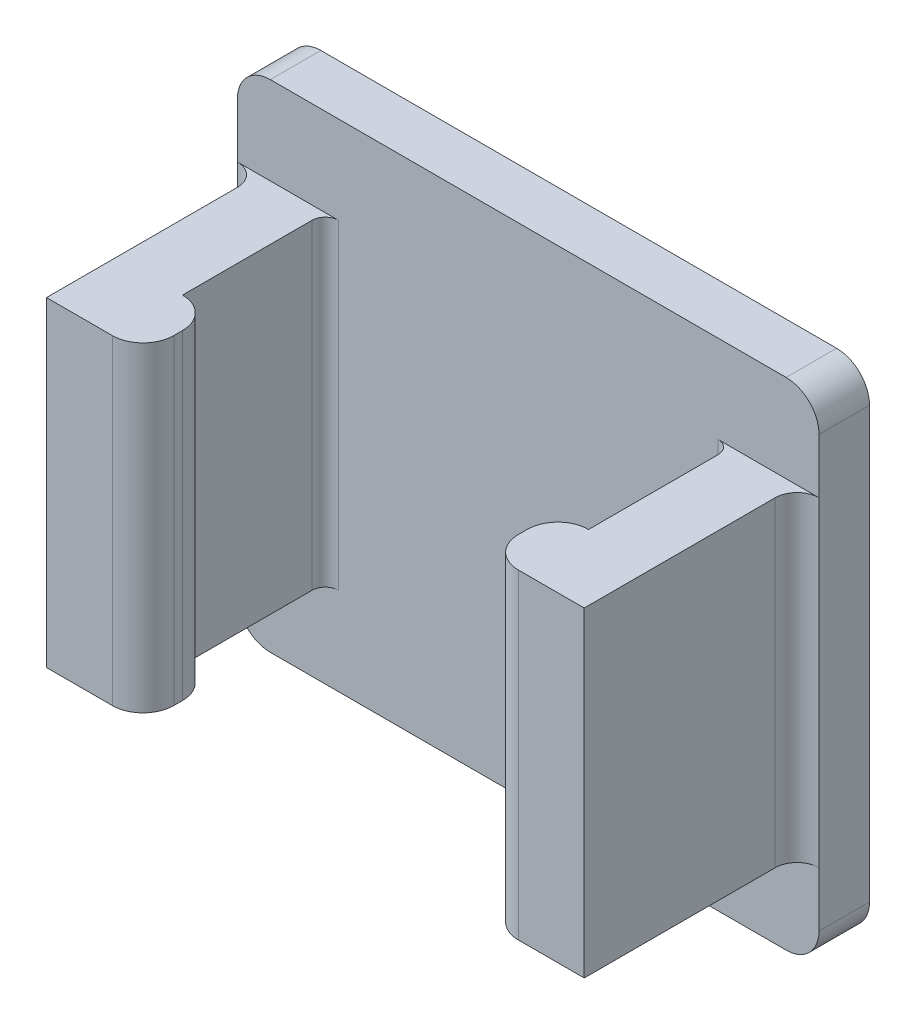
ISO-10303-21;
HEADER;
FILE_DESCRIPTION(('STEP AP214'),'2;1');
FILE_NAME('part.step','',(''),(''),'','','');
FILE_SCHEMA(('AUTOMOTIVE_DESIGN { 1 0 10303 214 1 1 1 1 }'));
ENDSEC;
DATA;
#1=APPLICATION_CONTEXT('core data for automotive mechanical design processes');
#2=APPLICATION_PROTOCOL_DEFINITION('international standard','automotive_design',2000,#1);
#3=PRODUCT_CONTEXT('',#1,'mechanical');
#4=PRODUCT('Part','Part','',(#3));
#5=PRODUCT_RELATED_PRODUCT_CATEGORY('part','',(#4));
#6=PRODUCT_DEFINITION_FORMATION('','',#4);
#7=PRODUCT_DEFINITION_CONTEXT('part definition',#1,'design');
#8=PRODUCT_DEFINITION('design','',#6,#7);
#9=PRODUCT_DEFINITION_SHAPE('','',#8);
#10=(LENGTH_UNIT() NAMED_UNIT(*) SI_UNIT(.MILLI.,.METRE.));
#11=(NAMED_UNIT(*) PLANE_ANGLE_UNIT() SI_UNIT($,.RADIAN.));
#12=(NAMED_UNIT(*) SI_UNIT($,.STERADIAN.) SOLID_ANGLE_UNIT());
#13=UNCERTAINTY_MEASURE_WITH_UNIT(LENGTH_MEASURE(1.E-05),#10,'distance_accuracy_value','');
#14=(GEOMETRIC_REPRESENTATION_CONTEXT(3) GLOBAL_UNCERTAINTY_ASSIGNED_CONTEXT((#13)) GLOBAL_UNIT_ASSIGNED_CONTEXT((#10,
#11,#12)) REPRESENTATION_CONTEXT('',''));
#15=CARTESIAN_POINT('',(0.,0.,0.));
#16=DIRECTION('',(0.,0.,1.));
#17=DIRECTION('',(1.,0.,0.));
#18=AXIS2_PLACEMENT_3D('',#15,#16,#17);
#19=CARTESIAN_POINT('',(-6.125,-5.65,2.15));
#20=DIRECTION('',(1.,0.,0.));
#21=DIRECTION('',(0.,0.,-1.));
#22=AXIS2_PLACEMENT_3D('',#19,#20,#21);
#23=PLANE('',#22);
#24=DIRECTION('',(0.,0.,1.));
#25=VECTOR('',#24,1.);
#26=CARTESIAN_POINT('',(-6.125,3.65,6.));
#27=LINE('',#26,#25);
#28=CARTESIAN_POINT('',(-6.125,3.65,1.65));
#29=VERTEX_POINT('',#28);
#30=CARTESIAN_POINT('',(-6.125,3.65,6.));
#31=VERTEX_POINT('',#30);
#32=EDGE_CURVE('E538',#29,#31,#27,.T.);
#33=ORIENTED_EDGE('',*,*,#32,.F.);
#34=DIRECTION('',(0.,1.,0.));
#35=VECTOR('',#34,1.);
#36=CARTESIAN_POINT('',(-6.125,-3.65,1.65));
#37=LINE('',#36,#35);
#38=CARTESIAN_POINT('',(-6.125,-3.65,1.65));
#39=VERTEX_POINT('',#38);
#40=EDGE_CURVE('E295',#29,#39,#37,.F.);
#41=ORIENTED_EDGE('',*,*,#40,.T.);
#42=DIRECTION('',(0.,0.,-1.));
#43=VECTOR('',#42,1.);
#44=CARTESIAN_POINT('',(-6.125,-3.65,6.));
#45=LINE('',#44,#43);
#46=CARTESIAN_POINT('',(-6.125,-3.65,6.));
#47=VERTEX_POINT('',#46);
#48=EDGE_CURVE('E430',#47,#39,#45,.T.);
#49=ORIENTED_EDGE('',*,*,#48,.F.);
#50=DIRECTION('',(0.,-1.,0.));
#51=VECTOR('',#50,1.);
#52=CARTESIAN_POINT('',(-6.125,5.65,6.));
#53=LINE('',#52,#51);
#54=EDGE_CURVE('E247',#31,#47,#53,.T.);
#55=ORIENTED_EDGE('',*,*,#54,.F.);
#56=EDGE_LOOP('',(#33,#41,#49,#55));
#57=FACE_BOUND('',#56,.T.);
#58=ADVANCED_FACE('F41',(#57),#23,.F.);
#59=CARTESIAN_POINT('',(6.125,-5.65,2.15));
#60=DIRECTION('',(-1.,0.,0.));
#61=DIRECTION('',(0.,0.,1.));
#62=AXIS2_PLACEMENT_3D('',#59,#60,#61);
#63=PLANE('',#62);
#64=DIRECTION('',(0.,0.,1.));
#65=VECTOR('',#64,1.);
#66=CARTESIAN_POINT('',(6.125,-3.65,6.));
#67=LINE('',#66,#65);
#68=CARTESIAN_POINT('',(6.125,-3.65,1.65));
#69=VERTEX_POINT('',#68);
#70=CARTESIAN_POINT('',(6.125,-3.65,6.));
#71=VERTEX_POINT('',#70);
#72=EDGE_CURVE('E217',#69,#71,#67,.T.);
#73=ORIENTED_EDGE('',*,*,#72,.F.);
#74=DIRECTION('',(0.,-1.,0.));
#75=VECTOR('',#74,1.);
#76=CARTESIAN_POINT('',(6.125,3.65,1.65));
#77=LINE('',#76,#75);
#78=CARTESIAN_POINT('',(6.125,3.65,1.65));
#79=VERTEX_POINT('',#78);
#80=EDGE_CURVE('E292',#69,#79,#77,.F.);
#81=ORIENTED_EDGE('',*,*,#80,.T.);
#82=DIRECTION('',(0.,0.,-1.));
#83=VECTOR('',#82,1.);
#84=CARTESIAN_POINT('',(6.125,3.65,6.));
#85=LINE('',#84,#83);
#86=CARTESIAN_POINT('',(6.125,3.65,6.));
#87=VERTEX_POINT('',#86);
#88=EDGE_CURVE('E245',#87,#79,#85,.T.);
#89=ORIENTED_EDGE('',*,*,#88,.F.);
#90=DIRECTION('',(0.,1.,0.));
#91=VECTOR('',#90,1.);
#92=CARTESIAN_POINT('',(6.125,5.65,6.));
#93=LINE('',#92,#91);
#94=EDGE_CURVE('E236',#71,#87,#93,.T.);
#95=ORIENTED_EDGE('',*,*,#94,.F.);
#96=EDGE_LOOP('',(#73,#81,#89,#95));
#97=FACE_BOUND('',#96,.T.);
#98=ADVANCED_FACE('F243',(#97),#63,.F.);
#99=CARTESIAN_POINT('',(4.625,5.65,6.));
#100=DIRECTION('',(1.,0.,0.));
#101=DIRECTION('',(0.,1.,0.));
#102=AXIS2_PLACEMENT_3D('',#99,#100,#101);
#103=PLANE('',#102);
#104=DIRECTION('',(0.,0.,-1.));
#105=VECTOR('',#104,1.);
#106=CARTESIAN_POINT('',(4.625,-3.65,6.));
#107=LINE('',#106,#105);
#108=CARTESIAN_POINT('',(4.625,-3.65,4.4));
#109=VERTEX_POINT('',#108);
#110=CARTESIAN_POINT('',(4.625,-3.65,1.45));
#111=VERTEX_POINT('',#110);
#112=EDGE_CURVE('E551',#109,#111,#107,.T.);
#113=ORIENTED_EDGE('',*,*,#112,.F.);
#114=DIRECTION('',(0.,-1.,0.));
#115=VECTOR('',#114,1.);
#116=CARTESIAN_POINT('',(4.625,-5.65,4.4));
#117=LINE('',#116,#115);
#118=CARTESIAN_POINT('',(4.625,3.65,4.4));
#119=VERTEX_POINT('',#118);
#120=EDGE_CURVE('E580',#119,#109,#117,.T.);
#121=ORIENTED_EDGE('',*,*,#120,.F.);
#122=DIRECTION('',(0.,0.,-1.));
#123=VECTOR('',#122,1.);
#124=CARTESIAN_POINT('',(4.625,3.65,6.));
#125=LINE('',#124,#123);
#126=CARTESIAN_POINT('',(4.625,3.65,1.45));
#127=VERTEX_POINT('',#126);
#128=EDGE_CURVE('E572',#119,#127,#125,.T.);
#129=ORIENTED_EDGE('',*,*,#128,.T.);
#130=DIRECTION('',(0.,1.,0.));
#131=VECTOR('',#130,1.);
#132=CARTESIAN_POINT('',(4.625,-5.65,1.45));
#133=LINE('',#132,#131);
#134=EDGE_CURVE('E278',#127,#111,#133,.F.);
#135=ORIENTED_EDGE('',*,*,#134,.T.);
#136=EDGE_LOOP('',(#113,#121,#129,#135));
#137=FACE_BOUND('',#136,.T.);
#138=ADVANCED_FACE('F470',(#137),#103,.F.);
#139=CARTESIAN_POINT('',(-4.625,5.65,6.));
#140=DIRECTION('',(-1.,0.,0.));
#141=DIRECTION('',(0.,-1.,0.));
#142=AXIS2_PLACEMENT_3D('',#139,#140,#141);
#143=PLANE('',#142);
#144=DIRECTION('',(0.,0.,1.));
#145=VECTOR('',#144,1.);
#146=CARTESIAN_POINT('',(-4.625,-3.65,6.));
#147=LINE('',#146,#145);
#148=CARTESIAN_POINT('',(-4.625,-3.65,1.45));
#149=VERTEX_POINT('',#148);
#150=CARTESIAN_POINT('',(-4.625,-3.65,4.4));
#151=VERTEX_POINT('',#150);
#152=EDGE_CURVE('E241',#149,#151,#147,.T.);
#153=ORIENTED_EDGE('',*,*,#152,.F.);
#154=DIRECTION('',(0.,-1.,0.));
#155=VECTOR('',#154,1.);
#156=CARTESIAN_POINT('',(-4.625,5.65,1.45));
#157=LINE('',#156,#155);
#158=CARTESIAN_POINT('',(-4.625,3.65,1.45));
#159=VERTEX_POINT('',#158);
#160=EDGE_CURVE('E282',#149,#159,#157,.F.);
#161=ORIENTED_EDGE('',*,*,#160,.T.);
#162=DIRECTION('',(0.,0.,1.));
#163=VECTOR('',#162,1.);
#164=CARTESIAN_POINT('',(-4.625,3.65,6.));
#165=LINE('',#164,#163);
#166=CARTESIAN_POINT('',(-4.625,3.65,4.4));
#167=VERTEX_POINT('',#166);
#168=EDGE_CURVE('E560',#159,#167,#165,.T.);
#169=ORIENTED_EDGE('',*,*,#168,.T.);
#170=DIRECTION('',(0.,1.,0.));
#171=VECTOR('',#170,1.);
#172=CARTESIAN_POINT('',(-4.625,5.65,4.4));
#173=LINE('',#172,#171);
#174=EDGE_CURVE('E256',#151,#167,#173,.T.);
#175=ORIENTED_EDGE('',*,*,#174,.F.);
#176=EDGE_LOOP('',(#153,#161,#169,#175));
#177=FACE_BOUND('',#176,.T.);
#178=ADVANCED_FACE('F590',(#177),#143,.F.);
#179=CARTESIAN_POINT('',(0.,0.,6.));
#180=DIRECTION('',(0.,0.,1.));
#181=DIRECTION('',(1.,0.,0.));
#182=AXIS2_PLACEMENT_3D('',#179,#180,#181);
#183=PLANE('',#182);
#184=DIRECTION('',(-1.,0.,0.));
#185=VECTOR('',#184,1.);
#186=CARTESIAN_POINT('',(-6.125,-3.65,6.));
#187=LINE('',#186,#185);
#188=CARTESIAN_POINT('',(-4.625,-3.65,6.));
#189=VERTEX_POINT('',#188);
#190=EDGE_CURVE('E229',#189,#47,#187,.T.);
#191=ORIENTED_EDGE('',*,*,#190,.F.);
#192=DIRECTION('',(0.,-1.,0.));
#193=VECTOR('',#192,1.);
#194=CARTESIAN_POINT('',(-4.625,0.,6.));
#195=LINE('',#194,#193);
#196=CARTESIAN_POINT('',(-4.625,3.65,6.));
#197=VERTEX_POINT('',#196);
#198=EDGE_CURVE('E325',#189,#197,#195,.F.);
#199=ORIENTED_EDGE('',*,*,#198,.T.);
#200=DIRECTION('',(1.,0.,0.));
#201=VECTOR('',#200,1.);
#202=CARTESIAN_POINT('',(-6.125,3.65,6.));
#203=LINE('',#202,#201);
#204=EDGE_CURVE('E548',#31,#197,#203,.T.);
#205=ORIENTED_EDGE('',*,*,#204,.F.);
#206=ORIENTED_EDGE('',*,*,#54,.T.);
#207=EDGE_LOOP('',(#191,#199,#205,#206));
#208=FACE_BOUND('',#207,.T.);
#209=ADVANCED_FACE('F633',(#208),#183,.T.);
#210=CARTESIAN_POINT('',(0.,0.,6.));
#211=DIRECTION('',(0.,0.,-1.));
#212=DIRECTION('',(-1.,0.,0.));
#213=AXIS2_PLACEMENT_3D('',#210,#211,#212);
#214=PLANE('',#213);
#215=CARTESIAN_POINT('',(4.625,3.65,6.));
#216=VERTEX_POINT('',#215);
#217=EDGE_CURVE('E543',#216,#87,#203,.T.);
#218=ORIENTED_EDGE('',*,*,#217,.F.);
#219=DIRECTION('',(0.,1.,0.));
#220=VECTOR('',#219,1.);
#221=CARTESIAN_POINT('',(4.625,-3.65,6.));
#222=LINE('',#221,#220);
#223=CARTESIAN_POINT('',(4.625,-3.65,6.));
#224=VERTEX_POINT('',#223);
#225=EDGE_CURVE('E239',#216,#224,#222,.F.);
#226=ORIENTED_EDGE('',*,*,#225,.T.);
#227=EDGE_CURVE('E221',#71,#224,#187,.T.);
#228=ORIENTED_EDGE('',*,*,#227,.F.);
#229=ORIENTED_EDGE('',*,*,#94,.T.);
#230=EDGE_LOOP('',(#218,#226,#228,#229));
#231=FACE_BOUND('',#230,.T.);
#232=ADVANCED_FACE('F235',(#231),#214,.F.);
#233=CARTESIAN_POINT('',(-3.925,0.,0.));
#234=DIRECTION('',(1.,0.,0.));
#235=DIRECTION('',(0.,1.,0.));
#236=AXIS2_PLACEMENT_3D('',#233,#234,#235);
#237=PLANE('',#236);
#238=DIRECTION('',(0.,0.,-1.));
#239=VECTOR('',#238,1.);
#240=CARTESIAN_POINT('',(-3.925,3.65,0.));
#241=LINE('',#240,#239);
#242=CARTESIAN_POINT('',(-3.925,3.65,5.3));
#243=VERTEX_POINT('',#242);
#244=CARTESIAN_POINT('',(-3.925,3.65,5.1));
#245=VERTEX_POINT('',#244);
#246=EDGE_CURVE('E564',#243,#245,#241,.T.);
#247=ORIENTED_EDGE('',*,*,#246,.F.);
#248=DIRECTION('',(0.,-1.,0.));
#249=VECTOR('',#248,1.);
#250=CARTESIAN_POINT('',(-3.925,0.,5.3));
#251=LINE('',#250,#249);
#252=CARTESIAN_POINT('',(-3.925,-3.65,5.3));
#253=VERTEX_POINT('',#252);
#254=EDGE_CURVE('E315',#243,#253,#251,.T.);
#255=ORIENTED_EDGE('',*,*,#254,.T.);
#256=DIRECTION('',(0.,0.,-1.));
#257=VECTOR('',#256,1.);
#258=CARTESIAN_POINT('',(-3.925,-3.65,0.));
#259=LINE('',#258,#257);
#260=CARTESIAN_POINT('',(-3.925,-3.65,5.1));
#261=VERTEX_POINT('',#260);
#262=EDGE_CURVE('E595',#253,#261,#259,.T.);
#263=ORIENTED_EDGE('',*,*,#262,.T.);
#264=DIRECTION('',(0.,1.,0.));
#265=VECTOR('',#264,1.);
#266=CARTESIAN_POINT('',(-3.925,3.65,5.1));
#267=LINE('',#266,#265);
#268=EDGE_CURVE('E311',#261,#245,#267,.T.);
#269=ORIENTED_EDGE('',*,*,#268,.T.);
#270=EDGE_LOOP('',(#247,#255,#263,#269));
#271=FACE_BOUND('',#270,.T.);
#272=ADVANCED_FACE('F619',(#271),#237,.T.);
#273=CARTESIAN_POINT('',(3.925,0.,0.));
#274=DIRECTION('',(-1.,0.,0.));
#275=DIRECTION('',(0.,-1.,0.));
#276=AXIS2_PLACEMENT_3D('',#273,#274,#275);
#277=PLANE('',#276);
#278=DIRECTION('',(0.,0.,1.));
#279=VECTOR('',#278,1.);
#280=CARTESIAN_POINT('',(3.925,3.65,0.));
#281=LINE('',#280,#279);
#282=CARTESIAN_POINT('',(3.925,3.65,5.1));
#283=VERTEX_POINT('',#282);
#284=CARTESIAN_POINT('',(3.925,3.65,5.3));
#285=VERTEX_POINT('',#284);
#286=EDGE_CURVE('E576',#283,#285,#281,.T.);
#287=ORIENTED_EDGE('',*,*,#286,.F.);
#288=DIRECTION('',(0.,-1.,0.));
#289=VECTOR('',#288,1.);
#290=CARTESIAN_POINT('',(3.925,-3.65,5.1));
#291=LINE('',#290,#289);
#292=CARTESIAN_POINT('',(3.925,-3.65,5.1));
#293=VERTEX_POINT('',#292);
#294=EDGE_CURVE('E338',#283,#293,#291,.T.);
#295=ORIENTED_EDGE('',*,*,#294,.T.);
#296=DIRECTION('',(0.,0.,1.));
#297=VECTOR('',#296,1.);
#298=CARTESIAN_POINT('',(3.925,-3.65,0.));
#299=LINE('',#298,#297);
#300=CARTESIAN_POINT('',(3.925,-3.65,5.3));
#301=VERTEX_POINT('',#300);
#302=EDGE_CURVE('E544',#293,#301,#299,.T.);
#303=ORIENTED_EDGE('',*,*,#302,.T.);
#304=DIRECTION('',(0.,1.,0.));
#305=VECTOR('',#304,1.);
#306=CARTESIAN_POINT('',(3.925,3.65,5.3));
#307=LINE('',#306,#305);
#308=EDGE_CURVE('E334',#301,#285,#307,.T.);
#309=ORIENTED_EDGE('',*,*,#308,.T.);
#310=EDGE_LOOP('',(#287,#295,#303,#309));
#311=FACE_BOUND('',#310,.T.);
#312=ADVANCED_FACE('F483',(#311),#277,.T.);
#313=CARTESIAN_POINT('',(4.325,0.,1.45));
#314=DIRECTION('',(0.,-1.,0.));
#315=DIRECTION('',(1.,0.,0.));
#316=AXIS2_PLACEMENT_3D('',#313,#314,#315);
#317=CYLINDRICAL_SURFACE('',#316,0.3);
#318=CARTESIAN_POINT('',(4.325,-3.65,1.45));
#319=DIRECTION('',(0.,-1.,0.));
#320=DIRECTION('',(0.,0.,-1.));
#321=AXIS2_PLACEMENT_3D('',#318,#319,#320);
#322=CIRCLE('',#321,0.3);
#323=CARTESIAN_POINT('',(4.325,-3.65,1.15));
#324=VERTEX_POINT('',#323);
#325=EDGE_CURVE('E598',#111,#324,#322,.F.);
#326=ORIENTED_EDGE('',*,*,#325,.F.);
#327=ORIENTED_EDGE('',*,*,#134,.F.);
#328=CARTESIAN_POINT('',(4.325,3.65,1.45));
#329=DIRECTION('',(0.,-1.,0.));
#330=DIRECTION('',(0.,0.,-1.));
#331=AXIS2_PLACEMENT_3D('',#328,#329,#330);
#332=CIRCLE('',#331,0.3);
#333=CARTESIAN_POINT('',(4.325,3.65,1.15));
#334=VERTEX_POINT('',#333);
#335=EDGE_CURVE('E568',#127,#334,#332,.F.);
#336=ORIENTED_EDGE('',*,*,#335,.T.);
#337=DIRECTION('',(0.,1.,0.));
#338=VECTOR('',#337,1.);
#339=CARTESIAN_POINT('',(4.325,5.65,1.15));
#340=LINE('',#339,#338);
#341=EDGE_CURVE('E275',#324,#334,#340,.T.);
#342=ORIENTED_EDGE('',*,*,#341,.F.);
#343=EDGE_LOOP('',(#326,#327,#336,#342));
#344=FACE_BOUND('',#343,.T.);
#345=ADVANCED_FACE('F480',(#344),#317,.F.);
#346=CARTESIAN_POINT('',(-4.325,0.,1.45));
#347=DIRECTION('',(0.,1.,0.));
#348=DIRECTION('',(-1.,0.,0.));
#349=AXIS2_PLACEMENT_3D('',#346,#347,#348);
#350=CYLINDRICAL_SURFACE('',#349,0.3);
#351=CARTESIAN_POINT('',(-4.325,-3.65,1.45));
#352=DIRECTION('',(0.,-1.,0.));
#353=DIRECTION('',(0.,0.,-1.));
#354=AXIS2_PLACEMENT_3D('',#351,#352,#353);
#355=CIRCLE('',#354,0.3);
#356=CARTESIAN_POINT('',(-4.325,-3.65,1.15));
#357=VERTEX_POINT('',#356);
#358=EDGE_CURVE('E289',#357,#149,#355,.F.);
#359=ORIENTED_EDGE('',*,*,#358,.F.);
#360=DIRECTION('',(0.,-1.,0.));
#361=VECTOR('',#360,1.);
#362=CARTESIAN_POINT('',(-4.325,-5.65,1.15));
#363=LINE('',#362,#361);
#364=CARTESIAN_POINT('',(-4.325,3.65,1.15));
#365=VERTEX_POINT('',#364);
#366=EDGE_CURVE('E271',#365,#357,#363,.T.);
#367=ORIENTED_EDGE('',*,*,#366,.F.);
#368=CARTESIAN_POINT('',(-4.325,3.65,1.45));
#369=DIRECTION('',(0.,-1.,0.));
#370=DIRECTION('',(0.,0.,-1.));
#371=AXIS2_PLACEMENT_3D('',#368,#369,#370);
#372=CIRCLE('',#371,0.3);
#373=EDGE_CURVE('E285',#365,#159,#372,.F.);
#374=ORIENTED_EDGE('',*,*,#373,.T.);
#375=ORIENTED_EDGE('',*,*,#160,.F.);
#376=EDGE_LOOP('',(#359,#367,#374,#375));
#377=FACE_BOUND('',#376,.T.);
#378=ADVANCED_FACE('F478',(#377),#350,.F.);
#379=CARTESIAN_POINT('',(-6.125,5.65,2.15));
#380=DIRECTION('',(0.,-1.,0.));
#381=DIRECTION('',(0.,0.,-1.));
#382=AXIS2_PLACEMENT_3D('',#379,#380,#381);
#383=PLANE('',#382);
#384=DIRECTION('',(-1.,0.,0.));
#385=VECTOR('',#384,1.);
#386=CARTESIAN_POINT('',(-6.125,5.65,0.));
#387=LINE('',#386,#385);
#388=CARTESIAN_POINT('',(5.875,5.65,0.));
#389=VERTEX_POINT('',#388);
#390=CARTESIAN_POINT('',(-5.875,5.65,0.));
#391=VERTEX_POINT('',#390);
#392=EDGE_CURVE('E253',#389,#391,#387,.T.);
#393=ORIENTED_EDGE('',*,*,#392,.T.);
#394=DIRECTION('',(0.,0.,-1.));
#395=VECTOR('',#394,1.);
#396=CARTESIAN_POINT('',(-5.875,5.65,2.15));
#397=LINE('',#396,#395);
#398=CARTESIAN_POINT('',(-5.875,5.65,1.15));
#399=VERTEX_POINT('',#398);
#400=EDGE_CURVE('E11',#391,#399,#397,.F.);
#401=ORIENTED_EDGE('',*,*,#400,.T.);
#402=DIRECTION('',(1.,0.,0.));
#403=VECTOR('',#402,1.);
#404=CARTESIAN_POINT('',(-6.125,5.65,1.15));
#405=LINE('',#404,#403);
#406=CARTESIAN_POINT('',(5.875,5.65,1.15));
#407=VERTEX_POINT('',#406);
#408=EDGE_CURVE('E248',#399,#407,#405,.T.);
#409=ORIENTED_EDGE('',*,*,#408,.T.);
#410=DIRECTION('',(0.,0.,1.));
#411=VECTOR('',#410,1.);
#412=CARTESIAN_POINT('',(5.875,5.65,0.));
#413=LINE('',#412,#411);
#414=EDGE_CURVE('E50',#407,#389,#413,.F.);
#415=ORIENTED_EDGE('',*,*,#414,.T.);
#416=EDGE_LOOP('',(#393,#401,#409,#415));
#417=FACE_BOUND('',#416,.T.);
#418=ADVANCED_FACE('F402',(#417),#383,.F.);
#419=CARTESIAN_POINT('',(-6.125,-5.65,2.15));
#420=DIRECTION('',(0.,1.,0.));
#421=DIRECTION('',(0.,0.,1.));
#422=AXIS2_PLACEMENT_3D('',#419,#420,#421);
#423=PLANE('',#422);
#424=DIRECTION('',(1.,0.,0.));
#425=VECTOR('',#424,1.);
#426=CARTESIAN_POINT('',(-6.125,-5.65,0.));
#427=LINE('',#426,#425);
#428=CARTESIAN_POINT('',(-5.875,-5.65,0.));
#429=VERTEX_POINT('',#428);
#430=CARTESIAN_POINT('',(5.875,-5.65,0.));
#431=VERTEX_POINT('',#430);
#432=EDGE_CURVE('E263',#429,#431,#427,.T.);
#433=ORIENTED_EDGE('',*,*,#432,.T.);
#434=DIRECTION('',(0.,0.,-1.));
#435=VECTOR('',#434,1.);
#436=CARTESIAN_POINT('',(5.875,-5.65,1.15));
#437=LINE('',#436,#435);
#438=CARTESIAN_POINT('',(5.875,-5.65,1.15));
#439=VERTEX_POINT('',#438);
#440=EDGE_CURVE('E379',#431,#439,#437,.F.);
#441=ORIENTED_EDGE('',*,*,#440,.T.);
#442=DIRECTION('',(-1.,0.,0.));
#443=VECTOR('',#442,1.);
#444=CARTESIAN_POINT('',(-6.125,-5.65,1.15));
#445=LINE('',#444,#443);
#446=CARTESIAN_POINT('',(-5.875,-5.65,1.15));
#447=VERTEX_POINT('',#446);
#448=EDGE_CURVE('E267',#439,#447,#445,.T.);
#449=ORIENTED_EDGE('',*,*,#448,.T.);
#450=DIRECTION('',(0.,0.,1.));
#451=VECTOR('',#450,1.);
#452=CARTESIAN_POINT('',(-5.875,-5.65,2.15));
#453=LINE('',#452,#451);
#454=EDGE_CURVE('E376',#447,#429,#453,.F.);
#455=ORIENTED_EDGE('',*,*,#454,.T.);
#456=EDGE_LOOP('',(#433,#441,#449,#455));
#457=FACE_BOUND('',#456,.T.);
#458=ADVANCED_FACE('F475',(#457),#423,.F.);
#459=CARTESIAN_POINT('',(0.,0.,0.));
#460=DIRECTION('',(0.,0.,-1.));
#461=DIRECTION('',(-1.,0.,0.));
#462=AXIS2_PLACEMENT_3D('',#459,#460,#461);
#463=PLANE('',#462);
#464=DIRECTION('',(0.,1.,0.));
#465=VECTOR('',#464,1.);
#466=CARTESIAN_POINT('',(6.625,5.65,0.));
#467=LINE('',#466,#465);
#468=CARTESIAN_POINT('',(6.625,-4.9,0.));
#469=VERTEX_POINT('',#468);
#470=CARTESIAN_POINT('',(6.625,4.9,0.));
#471=VERTEX_POINT('',#470);
#472=EDGE_CURVE('E419',#469,#471,#467,.T.);
#473=ORIENTED_EDGE('',*,*,#472,.F.);
#474=CARTESIAN_POINT('',(5.875,-4.9,0.));
#475=DIRECTION('',(0.,0.,-1.));
#476=DIRECTION('',(-1.,0.,0.));
#477=AXIS2_PLACEMENT_3D('',#474,#475,#476);
#478=CIRCLE('',#477,0.75);
#479=EDGE_CURVE('E373',#469,#431,#478,.T.);
#480=ORIENTED_EDGE('',*,*,#479,.T.);
#481=ORIENTED_EDGE('',*,*,#432,.F.);
#482=CARTESIAN_POINT('',(-5.875,-4.9,0.));
#483=DIRECTION('',(0.,0.,-1.));
#484=DIRECTION('',(-1.,0.,0.));
#485=AXIS2_PLACEMENT_3D('',#482,#483,#484);
#486=CIRCLE('',#485,0.75);
#487=CARTESIAN_POINT('',(-6.625,-4.9,0.));
#488=VERTEX_POINT('',#487);
#489=EDGE_CURVE('E370',#429,#488,#486,.T.);
#490=ORIENTED_EDGE('',*,*,#489,.T.);
#491=DIRECTION('',(0.,-1.,0.));
#492=VECTOR('',#491,1.);
#493=CARTESIAN_POINT('',(-6.625,5.65,0.));
#494=LINE('',#493,#492);
#495=CARTESIAN_POINT('',(-6.625,4.9,0.));
#496=VERTEX_POINT('',#495);
#497=EDGE_CURVE('E434',#496,#488,#494,.T.);
#498=ORIENTED_EDGE('',*,*,#497,.F.);
#499=CARTESIAN_POINT('',(-5.875,4.9,0.));
#500=DIRECTION('',(0.,0.,-1.));
#501=DIRECTION('',(-1.,0.,0.));
#502=AXIS2_PLACEMENT_3D('',#499,#500,#501);
#503=CIRCLE('',#502,0.75);
#504=EDGE_CURVE('E367',#496,#391,#503,.T.);
#505=ORIENTED_EDGE('',*,*,#504,.T.);
#506=ORIENTED_EDGE('',*,*,#392,.F.);
#507=CARTESIAN_POINT('',(5.875,4.9,0.));
#508=DIRECTION('',(0.,0.,-1.));
#509=DIRECTION('',(-1.,0.,0.));
#510=AXIS2_PLACEMENT_3D('',#507,#508,#509);
#511=CIRCLE('',#510,0.75);
#512=EDGE_CURVE('E364',#389,#471,#511,.T.);
#513=ORIENTED_EDGE('',*,*,#512,.T.);
#514=EDGE_LOOP('',(#473,#480,#481,#490,#498,#505,#506,#513));
#515=FACE_BOUND('',#514,.T.);
#516=ADVANCED_FACE('F408',(#515),#463,.T.);
#517=CARTESIAN_POINT('',(0.,0.,1.15));
#518=DIRECTION('',(0.,0.,-1.));
#519=DIRECTION('',(-1.,0.,0.));
#520=AXIS2_PLACEMENT_3D('',#517,#518,#519);
#521=PLANE('',#520);
#522=ORIENTED_EDGE('',*,*,#448,.F.);
#523=CARTESIAN_POINT('',(5.875,-4.9,1.15));
#524=DIRECTION('',(0.,0.,-1.));
#525=DIRECTION('',(-1.,0.,0.));
#526=AXIS2_PLACEMENT_3D('',#523,#524,#525);
#527=CIRCLE('',#526,0.75);
#528=CARTESIAN_POINT('',(6.625,-4.9,1.15));
#529=VERTEX_POINT('',#528);
#530=EDGE_CURVE('E389',#439,#529,#527,.F.);
#531=ORIENTED_EDGE('',*,*,#530,.T.);
#532=DIRECTION('',(0.,-1.,0.));
#533=VECTOR('',#532,1.);
#534=CARTESIAN_POINT('',(6.625,5.65,1.15));
#535=LINE('',#534,#533);
#536=CARTESIAN_POINT('',(6.625,-3.65,1.15));
#537=VERTEX_POINT('',#536);
#538=EDGE_CURVE('E427',#537,#529,#535,.T.);
#539=ORIENTED_EDGE('',*,*,#538,.F.);
#540=DIRECTION('',(1.,0.,0.));
#541=VECTOR('',#540,1.);
#542=CARTESIAN_POINT('',(-6.125,-3.65,1.15));
#543=LINE('',#542,#541);
#544=EDGE_CURVE('E526',#324,#537,#543,.T.);
#545=ORIENTED_EDGE('',*,*,#544,.F.);
#546=ORIENTED_EDGE('',*,*,#341,.T.);
#547=DIRECTION('',(-1.,0.,0.));
#548=VECTOR('',#547,1.);
#549=CARTESIAN_POINT('',(-6.125,3.65,1.15));
#550=LINE('',#549,#548);
#551=CARTESIAN_POINT('',(6.625,3.65,1.15));
#552=VERTEX_POINT('',#551);
#553=EDGE_CURVE('E423',#552,#334,#550,.T.);
#554=ORIENTED_EDGE('',*,*,#553,.F.);
#555=CARTESIAN_POINT('',(6.625,4.9,1.15));
#556=VERTEX_POINT('',#555);
#557=EDGE_CURVE('E417',#556,#552,#535,.T.);
#558=ORIENTED_EDGE('',*,*,#557,.F.);
#559=CARTESIAN_POINT('',(5.875,4.9,1.15));
#560=DIRECTION('',(0.,0.,-1.));
#561=DIRECTION('',(-1.,0.,0.));
#562=AXIS2_PLACEMENT_3D('',#559,#560,#561);
#563=CIRCLE('',#562,0.75);
#564=EDGE_CURVE('E382',#556,#407,#563,.F.);
#565=ORIENTED_EDGE('',*,*,#564,.T.);
#566=ORIENTED_EDGE('',*,*,#408,.F.);
#567=CARTESIAN_POINT('',(-5.875,4.9,1.15));
#568=DIRECTION('',(0.,0.,-1.));
#569=DIRECTION('',(-1.,0.,0.));
#570=AXIS2_PLACEMENT_3D('',#567,#568,#569);
#571=CIRCLE('',#570,0.75);
#572=CARTESIAN_POINT('',(-6.625,4.9,1.15));
#573=VERTEX_POINT('',#572);
#574=EDGE_CURVE('E65',#399,#573,#571,.F.);
#575=ORIENTED_EDGE('',*,*,#574,.T.);
#576=DIRECTION('',(0.,1.,0.));
#577=VECTOR('',#576,1.);
#578=CARTESIAN_POINT('',(-6.625,5.65,1.15));
#579=LINE('',#578,#577);
#580=CARTESIAN_POINT('',(-6.625,3.65,1.15));
#581=VERTEX_POINT('',#580);
#582=EDGE_CURVE('E444',#581,#573,#579,.T.);
#583=ORIENTED_EDGE('',*,*,#582,.F.);
#584=EDGE_CURVE('E540',#365,#581,#550,.T.);
#585=ORIENTED_EDGE('',*,*,#584,.F.);
#586=ORIENTED_EDGE('',*,*,#366,.T.);
#587=CARTESIAN_POINT('',(-6.625,-3.65,1.15));
#588=VERTEX_POINT('',#587);
#589=EDGE_CURVE('E230',#588,#357,#543,.T.);
#590=ORIENTED_EDGE('',*,*,#589,.F.);
#591=CARTESIAN_POINT('',(-6.625,-4.9,1.15));
#592=VERTEX_POINT('',#591);
#593=EDGE_CURVE('E439',#592,#588,#579,.T.);
#594=ORIENTED_EDGE('',*,*,#593,.F.);
#595=CARTESIAN_POINT('',(-5.875,-4.9,1.15));
#596=DIRECTION('',(0.,0.,-1.));
#597=DIRECTION('',(-1.,0.,0.));
#598=AXIS2_PLACEMENT_3D('',#595,#596,#597);
#599=CIRCLE('',#598,0.75);
#600=EDGE_CURVE('E57',#592,#447,#599,.F.);
#601=ORIENTED_EDGE('',*,*,#600,.T.);
#602=EDGE_LOOP('',(#522,#531,#539,#545,#546,#554,#558,#565,#566,#575,#583,#585,#586,#590,#594,#601));
#603=FACE_BOUND('',#602,.T.);
#604=ADVANCED_FACE('F421',(#603),#521,.F.);
#605=CARTESIAN_POINT('',(0.,3.65,0.));
#606=DIRECTION('',(0.,-1.,0.));
#607=DIRECTION('',(0.,0.,-1.));
#608=AXIS2_PLACEMENT_3D('',#605,#606,#607);
#609=PLANE('',#608);
#610=ORIENTED_EDGE('',*,*,#204,.T.);
#611=CARTESIAN_POINT('',(-4.625,3.65,5.3));
#612=DIRECTION('',(0.,-1.,0.));
#613=DIRECTION('',(0.,0.,-1.));
#614=AXIS2_PLACEMENT_3D('',#611,#612,#613);
#615=CIRCLE('',#614,0.7);
#616=EDGE_CURVE('E331',#197,#243,#615,.F.);
#617=ORIENTED_EDGE('',*,*,#616,.T.);
#618=ORIENTED_EDGE('',*,*,#246,.T.);
#619=CARTESIAN_POINT('',(-4.625,3.65,5.1));
#620=DIRECTION('',(0.,-1.,0.));
#621=DIRECTION('',(0.,0.,-1.));
#622=AXIS2_PLACEMENT_3D('',#619,#620,#621);
#623=CIRCLE('',#622,0.7);
#624=EDGE_CURVE('E328',#245,#167,#623,.F.);
#625=ORIENTED_EDGE('',*,*,#624,.T.);
#626=ORIENTED_EDGE('',*,*,#168,.F.);
#627=ORIENTED_EDGE('',*,*,#373,.F.);
#628=ORIENTED_EDGE('',*,*,#584,.T.);
#629=CARTESIAN_POINT('',(-6.625,3.65,1.65));
#630=DIRECTION('',(0.,-1.,0.));
#631=DIRECTION('',(0.,0.,-1.));
#632=AXIS2_PLACEMENT_3D('',#629,#630,#631);
#633=CIRCLE('',#632,0.5);
#634=EDGE_CURVE('E304',#581,#29,#633,.T.);
#635=ORIENTED_EDGE('',*,*,#634,.T.);
#636=ORIENTED_EDGE('',*,*,#32,.T.);
#637=EDGE_LOOP('',(#610,#617,#618,#625,#626,#627,#628,#635,#636));
#638=FACE_BOUND('',#637,.T.);
#639=ADVANCED_FACE('F537',(#638),#609,.F.);
#640=ORIENTED_EDGE('',*,*,#128,.F.);
#641=CARTESIAN_POINT('',(4.625,3.65,5.1));
#642=DIRECTION('',(0.,-1.,0.));
#643=DIRECTION('',(0.,0.,-1.));
#644=AXIS2_PLACEMENT_3D('',#641,#642,#643);
#645=CIRCLE('',#644,0.7);
#646=EDGE_CURVE('E351',#119,#283,#645,.F.);
#647=ORIENTED_EDGE('',*,*,#646,.T.);
#648=ORIENTED_EDGE('',*,*,#286,.T.);
#649=CARTESIAN_POINT('',(4.625,3.65,5.3));
#650=DIRECTION('',(0.,-1.,0.));
#651=DIRECTION('',(0.,0.,-1.));
#652=AXIS2_PLACEMENT_3D('',#649,#650,#651);
#653=CIRCLE('',#652,0.7);
#654=EDGE_CURVE('E348',#285,#216,#653,.F.);
#655=ORIENTED_EDGE('',*,*,#654,.T.);
#656=ORIENTED_EDGE('',*,*,#217,.T.);
#657=ORIENTED_EDGE('',*,*,#88,.T.);
#658=CARTESIAN_POINT('',(6.625,3.65,1.65));
#659=DIRECTION('',(0.,-1.,0.));
#660=DIRECTION('',(0.,0.,-1.));
#661=AXIS2_PLACEMENT_3D('',#658,#659,#660);
#662=CIRCLE('',#661,0.5);
#663=EDGE_CURVE('E300',#79,#552,#662,.T.);
#664=ORIENTED_EDGE('',*,*,#663,.T.);
#665=ORIENTED_EDGE('',*,*,#553,.T.);
#666=ORIENTED_EDGE('',*,*,#335,.F.);
#667=EDGE_LOOP('',(#640,#647,#648,#655,#656,#657,#664,#665,#666));
#668=FACE_BOUND('',#667,.T.);
#669=ADVANCED_FACE('F611',(#668),#609,.F.);
#670=CARTESIAN_POINT('',(0.,-3.65,0.));
#671=DIRECTION('',(0.,-1.,0.));
#672=DIRECTION('',(0.,0.,-1.));
#673=AXIS2_PLACEMENT_3D('',#670,#671,#672);
#674=PLANE('',#673);
#675=ORIENTED_EDGE('',*,*,#262,.F.);
#676=CARTESIAN_POINT('',(-4.625,-3.65,5.3));
#677=DIRECTION('',(0.,-1.,0.));
#678=DIRECTION('',(0.,0.,-1.));
#679=AXIS2_PLACEMENT_3D('',#676,#677,#678);
#680=CIRCLE('',#679,0.7);
#681=EDGE_CURVE('E322',#253,#189,#680,.T.);
#682=ORIENTED_EDGE('',*,*,#681,.T.);
#683=ORIENTED_EDGE('',*,*,#190,.T.);
#684=ORIENTED_EDGE('',*,*,#48,.T.);
#685=CARTESIAN_POINT('',(-6.625,-3.65,1.65));
#686=DIRECTION('',(0.,-1.,0.));
#687=DIRECTION('',(0.,0.,-1.));
#688=AXIS2_PLACEMENT_3D('',#685,#686,#687);
#689=CIRCLE('',#688,0.5);
#690=EDGE_CURVE('E307',#39,#588,#689,.F.);
#691=ORIENTED_EDGE('',*,*,#690,.T.);
#692=ORIENTED_EDGE('',*,*,#589,.T.);
#693=ORIENTED_EDGE('',*,*,#358,.T.);
#694=ORIENTED_EDGE('',*,*,#152,.T.);
#695=CARTESIAN_POINT('',(-4.625,-3.65,5.1));
#696=DIRECTION('',(0.,-1.,0.));
#697=DIRECTION('',(0.,0.,-1.));
#698=AXIS2_PLACEMENT_3D('',#695,#696,#697);
#699=CIRCLE('',#698,0.7);
#700=EDGE_CURVE('E319',#151,#261,#699,.T.);
#701=ORIENTED_EDGE('',*,*,#700,.T.);
#702=EDGE_LOOP('',(#675,#682,#683,#684,#691,#692,#693,#694,#701));
#703=FACE_BOUND('',#702,.T.);
#704=ADVANCED_FACE('F531',(#703),#674,.T.);
#705=ORIENTED_EDGE('',*,*,#302,.F.);
#706=CARTESIAN_POINT('',(4.625,-3.65,5.1));
#707=DIRECTION('',(0.,-1.,0.));
#708=DIRECTION('',(0.,0.,-1.));
#709=AXIS2_PLACEMENT_3D('',#706,#707,#708);
#710=CIRCLE('',#709,0.7);
#711=EDGE_CURVE('E345',#293,#109,#710,.T.);
#712=ORIENTED_EDGE('',*,*,#711,.T.);
#713=ORIENTED_EDGE('',*,*,#112,.T.);
#714=ORIENTED_EDGE('',*,*,#325,.T.);
#715=ORIENTED_EDGE('',*,*,#544,.T.);
#716=CARTESIAN_POINT('',(6.625,-3.65,1.65));
#717=DIRECTION('',(0.,-1.,0.));
#718=DIRECTION('',(0.,0.,-1.));
#719=AXIS2_PLACEMENT_3D('',#716,#717,#718);
#720=CIRCLE('',#719,0.5);
#721=EDGE_CURVE('E224',#537,#69,#720,.F.);
#722=ORIENTED_EDGE('',*,*,#721,.T.);
#723=ORIENTED_EDGE('',*,*,#72,.T.);
#724=ORIENTED_EDGE('',*,*,#227,.T.);
#725=CARTESIAN_POINT('',(4.625,-3.65,5.3));
#726=DIRECTION('',(0.,-1.,0.));
#727=DIRECTION('',(0.,0.,-1.));
#728=AXIS2_PLACEMENT_3D('',#725,#726,#727);
#729=CIRCLE('',#728,0.7);
#730=EDGE_CURVE('E342',#224,#301,#729,.T.);
#731=ORIENTED_EDGE('',*,*,#730,.T.);
#732=EDGE_LOOP('',(#705,#712,#713,#714,#715,#722,#723,#724,#731));
#733=FACE_BOUND('',#732,.T.);
#734=ADVANCED_FACE('F220',(#733),#674,.T.);
#735=CARTESIAN_POINT('',(6.625,0.,0.));
#736=DIRECTION('',(1.,0.,0.));
#737=DIRECTION('',(0.,0.,-1.));
#738=AXIS2_PLACEMENT_3D('',#735,#736,#737);
#739=PLANE('',#738);
#740=ORIENTED_EDGE('',*,*,#538,.T.);
#741=DIRECTION('',(0.,0.,-1.));
#742=VECTOR('',#741,1.);
#743=CARTESIAN_POINT('',(6.625,-4.9,0.));
#744=LINE('',#743,#742);
#745=EDGE_CURVE('E360',#529,#469,#744,.T.);
#746=ORIENTED_EDGE('',*,*,#745,.T.);
#747=ORIENTED_EDGE('',*,*,#472,.T.);
#748=DIRECTION('',(0.,0.,1.));
#749=VECTOR('',#748,1.);
#750=CARTESIAN_POINT('',(6.625,4.9,1.15));
#751=LINE('',#750,#749);
#752=EDGE_CURVE('E356',#471,#556,#751,.T.);
#753=ORIENTED_EDGE('',*,*,#752,.T.);
#754=ORIENTED_EDGE('',*,*,#557,.T.);
#755=EDGE_CURVE('E425',#552,#537,#535,.T.);
#756=ORIENTED_EDGE('',*,*,#755,.T.);
#757=EDGE_LOOP('',(#740,#746,#747,#753,#754,#756));
#758=FACE_BOUND('',#757,.T.);
#759=ADVANCED_FACE('F415',(#758),#739,.T.);
#760=CARTESIAN_POINT('',(-6.625,0.,0.));
#761=DIRECTION('',(1.,0.,0.));
#762=DIRECTION('',(0.,0.,-1.));
#763=AXIS2_PLACEMENT_3D('',#760,#761,#762);
#764=PLANE('',#763);
#765=ORIENTED_EDGE('',*,*,#497,.T.);
#766=DIRECTION('',(0.,0.,1.));
#767=VECTOR('',#766,1.);
#768=CARTESIAN_POINT('',(-6.625,-4.9,0.));
#769=LINE('',#768,#767);
#770=EDGE_CURVE('E396',#488,#592,#769,.T.);
#771=ORIENTED_EDGE('',*,*,#770,.T.);
#772=ORIENTED_EDGE('',*,*,#593,.T.);
#773=EDGE_CURVE('E442',#588,#581,#579,.T.);
#774=ORIENTED_EDGE('',*,*,#773,.T.);
#775=ORIENTED_EDGE('',*,*,#582,.T.);
#776=DIRECTION('',(0.,0.,-1.));
#777=VECTOR('',#776,1.);
#778=CARTESIAN_POINT('',(-6.625,4.9,0.));
#779=LINE('',#778,#777);
#780=EDGE_CURVE('E392',#573,#496,#779,.T.);
#781=ORIENTED_EDGE('',*,*,#780,.T.);
#782=EDGE_LOOP('',(#765,#771,#772,#774,#775,#781));
#783=FACE_BOUND('',#782,.T.);
#784=ADVANCED_FACE('F451',(#783),#764,.F.);
#785=CARTESIAN_POINT('',(6.625,0.,1.65));
#786=DIRECTION('',(0.,1.,0.));
#787=DIRECTION('',(0.,0.,1.));
#788=AXIS2_PLACEMENT_3D('',#785,#786,#787);
#789=CYLINDRICAL_SURFACE('',#788,0.5);
#790=ORIENTED_EDGE('',*,*,#663,.F.);
#791=ORIENTED_EDGE('',*,*,#80,.F.);
#792=ORIENTED_EDGE('',*,*,#721,.F.);
#793=ORIENTED_EDGE('',*,*,#755,.F.);
#794=EDGE_LOOP('',(#790,#791,#792,#793));
#795=FACE_BOUND('',#794,.T.);
#796=ADVANCED_FACE('F488',(#795),#789,.F.);
#797=CARTESIAN_POINT('',(-6.625,0.,1.65));
#798=DIRECTION('',(0.,-1.,0.));
#799=DIRECTION('',(0.,0.,-1.));
#800=AXIS2_PLACEMENT_3D('',#797,#798,#799);
#801=CYLINDRICAL_SURFACE('',#800,0.5);
#802=ORIENTED_EDGE('',*,*,#690,.F.);
#803=ORIENTED_EDGE('',*,*,#40,.F.);
#804=ORIENTED_EDGE('',*,*,#634,.F.);
#805=ORIENTED_EDGE('',*,*,#773,.F.);
#806=EDGE_LOOP('',(#802,#803,#804,#805));
#807=FACE_BOUND('',#806,.T.);
#808=ADVANCED_FACE('F491',(#807),#801,.F.);
#809=CARTESIAN_POINT('',(-4.625,0.,5.3));
#810=DIRECTION('',(0.,-1.,0.));
#811=DIRECTION('',(1.,0.,0.));
#812=AXIS2_PLACEMENT_3D('',#809,#810,#811);
#813=CYLINDRICAL_SURFACE('',#812,0.7);
#814=ORIENTED_EDGE('',*,*,#616,.F.);
#815=ORIENTED_EDGE('',*,*,#198,.F.);
#816=ORIENTED_EDGE('',*,*,#681,.F.);
#817=ORIENTED_EDGE('',*,*,#254,.F.);
#818=EDGE_LOOP('',(#814,#815,#816,#817));
#819=FACE_BOUND('',#818,.T.);
#820=ADVANCED_FACE('F495',(#819),#813,.T.);
#821=CARTESIAN_POINT('',(-4.625,0.,5.1));
#822=DIRECTION('',(0.,-1.,0.));
#823=DIRECTION('',(1.,0.,0.));
#824=AXIS2_PLACEMENT_3D('',#821,#822,#823);
#825=CYLINDRICAL_SURFACE('',#824,0.7);
#826=ORIENTED_EDGE('',*,*,#700,.F.);
#827=ORIENTED_EDGE('',*,*,#174,.T.);
#828=ORIENTED_EDGE('',*,*,#624,.F.);
#829=ORIENTED_EDGE('',*,*,#268,.F.);
#830=EDGE_LOOP('',(#826,#827,#828,#829));
#831=FACE_BOUND('',#830,.T.);
#832=ADVANCED_FACE('F499',(#831),#825,.T.);
#833=CARTESIAN_POINT('',(4.625,0.,5.1));
#834=DIRECTION('',(0.,1.,0.));
#835=DIRECTION('',(-1.,0.,0.));
#836=AXIS2_PLACEMENT_3D('',#833,#834,#835);
#837=CYLINDRICAL_SURFACE('',#836,0.7);
#838=ORIENTED_EDGE('',*,*,#646,.F.);
#839=ORIENTED_EDGE('',*,*,#120,.T.);
#840=ORIENTED_EDGE('',*,*,#711,.F.);
#841=ORIENTED_EDGE('',*,*,#294,.F.);
#842=EDGE_LOOP('',(#838,#839,#840,#841));
#843=FACE_BOUND('',#842,.T.);
#844=ADVANCED_FACE('F503',(#843),#837,.T.);
#845=CARTESIAN_POINT('',(4.625,0.,5.3));
#846=DIRECTION('',(0.,-1.,0.));
#847=DIRECTION('',(1.,0.,0.));
#848=AXIS2_PLACEMENT_3D('',#845,#846,#847);
#849=CYLINDRICAL_SURFACE('',#848,0.7);
#850=ORIENTED_EDGE('',*,*,#730,.F.);
#851=ORIENTED_EDGE('',*,*,#225,.F.);
#852=ORIENTED_EDGE('',*,*,#654,.F.);
#853=ORIENTED_EDGE('',*,*,#308,.F.);
#854=EDGE_LOOP('',(#850,#851,#852,#853));
#855=FACE_BOUND('',#854,.T.);
#856=ADVANCED_FACE('F507',(#855),#849,.T.);
#857=CARTESIAN_POINT('',(5.875,-4.9,0.));
#858=DIRECTION('',(0.,0.,1.));
#859=DIRECTION('',(1.,0.,0.));
#860=AXIS2_PLACEMENT_3D('',#857,#858,#859);
#861=CYLINDRICAL_SURFACE('',#860,0.75);
#862=ORIENTED_EDGE('',*,*,#530,.F.);
#863=ORIENTED_EDGE('',*,*,#440,.F.);
#864=ORIENTED_EDGE('',*,*,#479,.F.);
#865=ORIENTED_EDGE('',*,*,#745,.F.);
#866=EDGE_LOOP('',(#862,#863,#864,#865));
#867=FACE_BOUND('',#866,.T.);
#868=ADVANCED_FACE('F462',(#867),#861,.T.);
#869=CARTESIAN_POINT('',(-5.875,-4.9,0.));
#870=DIRECTION('',(0.,0.,1.));
#871=DIRECTION('',(1.,0.,0.));
#872=AXIS2_PLACEMENT_3D('',#869,#870,#871);
#873=CYLINDRICAL_SURFACE('',#872,0.75);
#874=ORIENTED_EDGE('',*,*,#489,.F.);
#875=ORIENTED_EDGE('',*,*,#454,.F.);
#876=ORIENTED_EDGE('',*,*,#600,.F.);
#877=ORIENTED_EDGE('',*,*,#770,.F.);
#878=EDGE_LOOP('',(#874,#875,#876,#877));
#879=FACE_BOUND('',#878,.T.);
#880=ADVANCED_FACE('F457',(#879),#873,.T.);
#881=CARTESIAN_POINT('',(-5.875,4.9,0.));
#882=DIRECTION('',(0.,0.,-1.));
#883=DIRECTION('',(-1.,0.,0.));
#884=AXIS2_PLACEMENT_3D('',#881,#882,#883);
#885=CYLINDRICAL_SURFACE('',#884,0.75);
#886=ORIENTED_EDGE('',*,*,#574,.F.);
#887=ORIENTED_EDGE('',*,*,#400,.F.);
#888=ORIENTED_EDGE('',*,*,#504,.F.);
#889=ORIENTED_EDGE('',*,*,#780,.F.);
#890=EDGE_LOOP('',(#886,#887,#888,#889));
#891=FACE_BOUND('',#890,.T.);
#892=ADVANCED_FACE('F455',(#891),#885,.T.);
#893=CARTESIAN_POINT('',(5.875,4.9,0.));
#894=DIRECTION('',(0.,0.,-1.));
#895=DIRECTION('',(-1.,0.,0.));
#896=AXIS2_PLACEMENT_3D('',#893,#894,#895);
#897=CYLINDRICAL_SURFACE('',#896,0.75);
#898=ORIENTED_EDGE('',*,*,#512,.F.);
#899=ORIENTED_EDGE('',*,*,#414,.F.);
#900=ORIENTED_EDGE('',*,*,#564,.F.);
#901=ORIENTED_EDGE('',*,*,#752,.F.);
#902=EDGE_LOOP('',(#898,#899,#900,#901));
#903=FACE_BOUND('',#902,.T.);
#904=ADVANCED_FACE('F43',(#903),#897,.T.);
#905=CLOSED_SHELL('',(#58,#98,#138,#178,#209,#232,#272,#312,#345,#378,#418,#458,#516,#604,#639,
#669,#704,#734,#759,#784,#796,#808,#820,#832,#844,#856,#868,#880,#892,#904));
#906=MANIFOLD_SOLID_BREP('B2',#905);
#907=ADVANCED_BREP_SHAPE_REPRESENTATION('',(#18,#906),#14);
#908=SHAPE_DEFINITION_REPRESENTATION(#9,#907);
ENDSEC;
END-ISO-10303-21;
